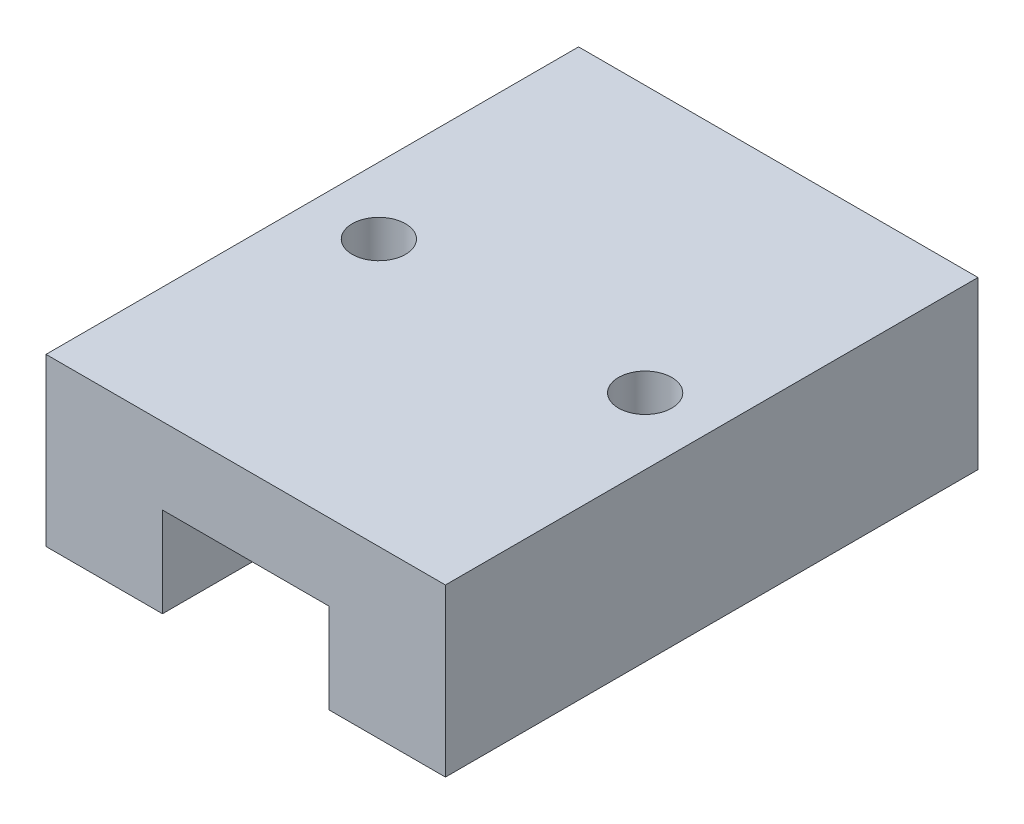
ISO-10303-21;
HEADER;
FILE_DESCRIPTION(('STEP AP214'),'2;1');
FILE_NAME('part.step','',(''),(''),'','','');
FILE_SCHEMA(('AUTOMOTIVE_DESIGN { 1 0 10303 214 1 1 1 1 }'));
ENDSEC;
DATA;
#1=APPLICATION_CONTEXT('core data for automotive mechanical design processes');
#2=APPLICATION_PROTOCOL_DEFINITION('international standard','automotive_design',2000,#1);
#3=PRODUCT_CONTEXT('',#1,'mechanical');
#4=PRODUCT('Part','Part','',(#3));
#5=PRODUCT_RELATED_PRODUCT_CATEGORY('part','',(#4));
#6=PRODUCT_DEFINITION_FORMATION('','',#4);
#7=PRODUCT_DEFINITION_CONTEXT('part definition',#1,'design');
#8=PRODUCT_DEFINITION('design','',#6,#7);
#9=PRODUCT_DEFINITION_SHAPE('','',#8);
#10=(LENGTH_UNIT() NAMED_UNIT(*) SI_UNIT(.MILLI.,.METRE.));
#11=(NAMED_UNIT(*) PLANE_ANGLE_UNIT() SI_UNIT($,.RADIAN.));
#12=(NAMED_UNIT(*) SI_UNIT($,.STERADIAN.) SOLID_ANGLE_UNIT());
#13=UNCERTAINTY_MEASURE_WITH_UNIT(LENGTH_MEASURE(1.E-05),#10,'distance_accuracy_value','');
#14=(GEOMETRIC_REPRESENTATION_CONTEXT(3) GLOBAL_UNCERTAINTY_ASSIGNED_CONTEXT((#13)) GLOBAL_UNIT_ASSIGNED_CONTEXT((#10,
#11,#12)) REPRESENTATION_CONTEXT('',''));
#15=CARTESIAN_POINT('',(0.,0.,0.));
#16=DIRECTION('',(0.,0.,1.));
#17=DIRECTION('',(1.,0.,0.));
#18=AXIS2_PLACEMENT_3D('',#15,#16,#17);
#19=CARTESIAN_POINT('',(2.5,2.7,8.));
#20=DIRECTION('',(0.,1.,0.));
#21=DIRECTION('',(0.,0.,1.));
#22=AXIS2_PLACEMENT_3D('',#19,#20,#21);
#23=PLANE('',#22);
#24=DIRECTION('',(1.,0.,0.));
#25=VECTOR('',#24,1.);
#26=CARTESIAN_POINT('',(2.5,2.7,-8.));
#27=LINE('',#26,#25);
#28=CARTESIAN_POINT('',(-2.5,2.7,-8.));
#29=VERTEX_POINT('',#28);
#30=CARTESIAN_POINT('',(2.5,2.7,-8.));
#31=VERTEX_POINT('',#30);
#32=EDGE_CURVE('E139',#29,#31,#27,.T.);
#33=ORIENTED_EDGE('',*,*,#32,.T.);
#34=DIRECTION('',(0.,0.,-1.));
#35=VECTOR('',#34,1.);
#36=CARTESIAN_POINT('',(2.5,2.7,8.));
#37=LINE('',#36,#35);
#38=CARTESIAN_POINT('',(2.5,2.7,8.));
#39=VERTEX_POINT('',#38);
#40=EDGE_CURVE('E11',#39,#31,#37,.T.);
#41=ORIENTED_EDGE('',*,*,#40,.F.);
#42=DIRECTION('',(1.,0.,0.));
#43=VECTOR('',#42,1.);
#44=CARTESIAN_POINT('',(2.5,2.7,8.));
#45=LINE('',#44,#43);
#46=CARTESIAN_POINT('',(-2.5,2.7,8.));
#47=VERTEX_POINT('',#46);
#48=EDGE_CURVE('E154',#47,#39,#45,.T.);
#49=ORIENTED_EDGE('',*,*,#48,.F.);
#50=DIRECTION('',(0.,0.,-1.));
#51=VECTOR('',#50,1.);
#52=CARTESIAN_POINT('',(-2.5,2.7,8.));
#53=LINE('',#52,#51);
#54=EDGE_CURVE('E135',#47,#29,#53,.T.);
#55=ORIENTED_EDGE('',*,*,#54,.T.);
#56=EDGE_LOOP('',(#33,#41,#49,#55));
#57=FACE_BOUND('',#56,.T.);
#58=ADVANCED_FACE('F40',(#57),#23,.F.);
#59=CARTESIAN_POINT('',(2.5,0.,8.));
#60=DIRECTION('',(1.,0.,0.));
#61=DIRECTION('',(0.,0.,-1.));
#62=AXIS2_PLACEMENT_3D('',#59,#60,#61);
#63=PLANE('',#62);
#64=DIRECTION('',(0.,-1.,0.));
#65=VECTOR('',#64,1.);
#66=CARTESIAN_POINT('',(2.5,0.,-8.));
#67=LINE('',#66,#65);
#68=CARTESIAN_POINT('',(2.5,0.,-8.));
#69=VERTEX_POINT('',#68);
#70=EDGE_CURVE('E142',#31,#69,#67,.T.);
#71=ORIENTED_EDGE('',*,*,#70,.T.);
#72=DIRECTION('',(0.,0.,-1.));
#73=VECTOR('',#72,1.);
#74=CARTESIAN_POINT('',(2.5,0.,8.));
#75=LINE('',#74,#73);
#76=CARTESIAN_POINT('',(2.5,0.,8.));
#77=VERTEX_POINT('',#76);
#78=EDGE_CURVE('E48',#77,#69,#75,.T.);
#79=ORIENTED_EDGE('',*,*,#78,.F.);
#80=DIRECTION('',(0.,-1.,0.));
#81=VECTOR('',#80,1.);
#82=CARTESIAN_POINT('',(2.5,0.,8.));
#83=LINE('',#82,#81);
#84=EDGE_CURVE('E100',#39,#77,#83,.T.);
#85=ORIENTED_EDGE('',*,*,#84,.F.);
#86=ORIENTED_EDGE('',*,*,#40,.T.);
#87=EDGE_LOOP('',(#71,#79,#85,#86));
#88=FACE_BOUND('',#87,.T.);
#89=ADVANCED_FACE('F222',(#88),#63,.F.);
#90=CARTESIAN_POINT('',(6.,0.,8.));
#91=DIRECTION('',(0.,1.,0.));
#92=DIRECTION('',(-1.,0.,0.));
#93=AXIS2_PLACEMENT_3D('',#90,#91,#92);
#94=PLANE('',#93);
#95=DIRECTION('',(1.,0.,0.));
#96=VECTOR('',#95,1.);
#97=CARTESIAN_POINT('',(6.,0.,-8.));
#98=LINE('',#97,#96);
#99=CARTESIAN_POINT('',(6.,0.,-8.));
#100=VERTEX_POINT('',#99);
#101=EDGE_CURVE('E145',#69,#100,#98,.T.);
#102=ORIENTED_EDGE('',*,*,#101,.T.);
#103=DIRECTION('',(0.,0.,-1.));
#104=VECTOR('',#103,1.);
#105=CARTESIAN_POINT('',(6.,0.,8.));
#106=LINE('',#105,#104);
#107=CARTESIAN_POINT('',(6.,0.,8.));
#108=VERTEX_POINT('',#107);
#109=EDGE_CURVE('E161',#108,#100,#106,.T.);
#110=ORIENTED_EDGE('',*,*,#109,.F.);
#111=DIRECTION('',(1.,0.,0.));
#112=VECTOR('',#111,1.);
#113=CARTESIAN_POINT('',(6.,0.,8.));
#114=LINE('',#113,#112);
#115=EDGE_CURVE('E169',#77,#108,#114,.T.);
#116=ORIENTED_EDGE('',*,*,#115,.F.);
#117=ORIENTED_EDGE('',*,*,#78,.T.);
#118=EDGE_LOOP('',(#102,#110,#116,#117));
#119=FACE_BOUND('',#118,.T.);
#120=ADVANCED_FACE('F167',(#119),#94,.F.);
#121=CARTESIAN_POINT('',(6.,5.,8.));
#122=DIRECTION('',(-1.,0.,0.));
#123=DIRECTION('',(0.,-1.,0.));
#124=AXIS2_PLACEMENT_3D('',#121,#122,#123);
#125=PLANE('',#124);
#126=DIRECTION('',(0.,1.,0.));
#127=VECTOR('',#126,1.);
#128=CARTESIAN_POINT('',(6.,5.,-8.));
#129=LINE('',#128,#127);
#130=CARTESIAN_POINT('',(6.,5.,-8.));
#131=VERTEX_POINT('',#130);
#132=EDGE_CURVE('E147',#100,#131,#129,.T.);
#133=ORIENTED_EDGE('',*,*,#132,.T.);
#134=DIRECTION('',(0.,0.,-1.));
#135=VECTOR('',#134,1.);
#136=CARTESIAN_POINT('',(6.,5.,8.));
#137=LINE('',#136,#135);
#138=CARTESIAN_POINT('',(6.,5.,8.));
#139=VERTEX_POINT('',#138);
#140=EDGE_CURVE('E158',#139,#131,#137,.T.);
#141=ORIENTED_EDGE('',*,*,#140,.F.);
#142=DIRECTION('',(0.,1.,0.));
#143=VECTOR('',#142,1.);
#144=CARTESIAN_POINT('',(6.,5.,8.));
#145=LINE('',#144,#143);
#146=EDGE_CURVE('E181',#108,#139,#145,.T.);
#147=ORIENTED_EDGE('',*,*,#146,.F.);
#148=ORIENTED_EDGE('',*,*,#109,.T.);
#149=EDGE_LOOP('',(#133,#141,#147,#148));
#150=FACE_BOUND('',#149,.T.);
#151=ADVANCED_FACE('F177',(#150),#125,.F.);
#152=CARTESIAN_POINT('',(-6.,5.,8.));
#153=DIRECTION('',(0.,-1.,0.));
#154=DIRECTION('',(0.,0.,-1.));
#155=AXIS2_PLACEMENT_3D('',#152,#153,#154);
#156=PLANE('',#155);
#157=CARTESIAN_POINT('',(-4.,5.,0.));
#158=DIRECTION('',(0.,1.,0.));
#159=DIRECTION('',(0.,0.,1.));
#160=AXIS2_PLACEMENT_3D('',#157,#158,#159);
#161=CIRCLE('',#160,0.799999999999999);
#162=CARTESIAN_POINT('',(-4.,5.,0.799999999999999));
#163=VERTEX_POINT('',#162);
#164=EDGE_CURVE('E195',#163,#163,#161,.T.);
#165=ORIENTED_EDGE('',*,*,#164,.F.);
#166=EDGE_LOOP('',(#165));
#167=FACE_BOUND('',#166,.T.);
#168=CARTESIAN_POINT('',(4.,5.,0.));
#169=DIRECTION('',(0.,1.,0.));
#170=DIRECTION('',(0.,0.,1.));
#171=AXIS2_PLACEMENT_3D('',#168,#169,#170);
#172=CIRCLE('',#171,0.799999999999999);
#173=CARTESIAN_POINT('',(4.,5.,0.799999999999997));
#174=VERTEX_POINT('',#173);
#175=EDGE_CURVE('E189',#174,#174,#172,.T.);
#176=ORIENTED_EDGE('',*,*,#175,.F.);
#177=EDGE_LOOP('',(#176));
#178=FACE_BOUND('',#177,.T.);
#179=DIRECTION('',(-1.,0.,0.));
#180=VECTOR('',#179,1.);
#181=CARTESIAN_POINT('',(-6.,5.,-8.));
#182=LINE('',#181,#180);
#183=CARTESIAN_POINT('',(-6.,5.,-8.));
#184=VERTEX_POINT('',#183);
#185=EDGE_CURVE('E149',#131,#184,#182,.T.);
#186=ORIENTED_EDGE('',*,*,#185,.T.);
#187=DIRECTION('',(0.,0.,-1.));
#188=VECTOR('',#187,1.);
#189=CARTESIAN_POINT('',(-6.,5.,8.));
#190=LINE('',#189,#188);
#191=CARTESIAN_POINT('',(-6.,5.,8.));
#192=VERTEX_POINT('',#191);
#193=EDGE_CURVE('E130',#192,#184,#190,.T.);
#194=ORIENTED_EDGE('',*,*,#193,.F.);
#195=DIRECTION('',(-1.,0.,0.));
#196=VECTOR('',#195,1.);
#197=CARTESIAN_POINT('',(-6.,5.,8.));
#198=LINE('',#197,#196);
#199=EDGE_CURVE('E121',#139,#192,#198,.T.);
#200=ORIENTED_EDGE('',*,*,#199,.F.);
#201=ORIENTED_EDGE('',*,*,#140,.T.);
#202=EDGE_LOOP('',(#186,#194,#200,#201));
#203=FACE_BOUND('',#202,.T.);
#204=ADVANCED_FACE('F180',(#167,#178,#203),#156,.F.);
#205=CARTESIAN_POINT('',(-6.,5.,8.));
#206=DIRECTION('',(1.,0.,0.));
#207=DIRECTION('',(0.,1.,0.));
#208=AXIS2_PLACEMENT_3D('',#205,#206,#207);
#209=PLANE('',#208);
#210=DIRECTION('',(0.,-1.,0.));
#211=VECTOR('',#210,1.);
#212=CARTESIAN_POINT('',(-6.,5.,-8.));
#213=LINE('',#212,#211);
#214=CARTESIAN_POINT('',(-6.,0.,-8.));
#215=VERTEX_POINT('',#214);
#216=EDGE_CURVE('E129',#184,#215,#213,.T.);
#217=ORIENTED_EDGE('',*,*,#216,.T.);
#218=DIRECTION('',(0.,0.,-1.));
#219=VECTOR('',#218,1.);
#220=CARTESIAN_POINT('',(-6.,0.,8.));
#221=LINE('',#220,#219);
#222=CARTESIAN_POINT('',(-6.,0.,8.));
#223=VERTEX_POINT('',#222);
#224=EDGE_CURVE('E126',#223,#215,#221,.T.);
#225=ORIENTED_EDGE('',*,*,#224,.F.);
#226=DIRECTION('',(0.,-1.,0.));
#227=VECTOR('',#226,1.);
#228=CARTESIAN_POINT('',(-6.,5.,8.));
#229=LINE('',#228,#227);
#230=EDGE_CURVE('E115',#192,#223,#229,.T.);
#231=ORIENTED_EDGE('',*,*,#230,.F.);
#232=ORIENTED_EDGE('',*,*,#193,.T.);
#233=EDGE_LOOP('',(#217,#225,#231,#232));
#234=FACE_BOUND('',#233,.T.);
#235=ADVANCED_FACE('F127',(#234),#209,.F.);
#236=CARTESIAN_POINT('',(-6.,0.,8.));
#237=DIRECTION('',(0.,1.,0.));
#238=DIRECTION('',(-1.,0.,0.));
#239=AXIS2_PLACEMENT_3D('',#236,#237,#238);
#240=PLANE('',#239);
#241=DIRECTION('',(1.,0.,0.));
#242=VECTOR('',#241,1.);
#243=CARTESIAN_POINT('',(-6.,0.,-8.));
#244=LINE('',#243,#242);
#245=CARTESIAN_POINT('',(-2.5,0.,-8.));
#246=VERTEX_POINT('',#245);
#247=EDGE_CURVE('E86',#215,#246,#244,.T.);
#248=ORIENTED_EDGE('',*,*,#247,.T.);
#249=DIRECTION('',(0.,0.,-1.));
#250=VECTOR('',#249,1.);
#251=CARTESIAN_POINT('',(-2.5,0.,8.));
#252=LINE('',#251,#250);
#253=CARTESIAN_POINT('',(-2.5,0.,8.));
#254=VERTEX_POINT('',#253);
#255=EDGE_CURVE('E131',#254,#246,#252,.T.);
#256=ORIENTED_EDGE('',*,*,#255,.F.);
#257=DIRECTION('',(1.,0.,0.));
#258=VECTOR('',#257,1.);
#259=CARTESIAN_POINT('',(-6.,0.,8.));
#260=LINE('',#259,#258);
#261=EDGE_CURVE('E119',#223,#254,#260,.T.);
#262=ORIENTED_EDGE('',*,*,#261,.F.);
#263=ORIENTED_EDGE('',*,*,#224,.T.);
#264=EDGE_LOOP('',(#248,#256,#262,#263));
#265=FACE_BOUND('',#264,.T.);
#266=ADVANCED_FACE('F133',(#265),#240,.F.);
#267=CARTESIAN_POINT('',(-2.5,0.,8.));
#268=DIRECTION('',(-1.,0.,0.));
#269=DIRECTION('',(0.,0.,1.));
#270=AXIS2_PLACEMENT_3D('',#267,#268,#269);
#271=PLANE('',#270);
#272=DIRECTION('',(0.,1.,0.));
#273=VECTOR('',#272,1.);
#274=CARTESIAN_POINT('',(-2.5,0.,-8.));
#275=LINE('',#274,#273);
#276=EDGE_CURVE('E92',#246,#29,#275,.T.);
#277=ORIENTED_EDGE('',*,*,#276,.T.);
#278=ORIENTED_EDGE('',*,*,#54,.F.);
#279=DIRECTION('',(0.,1.,0.));
#280=VECTOR('',#279,1.);
#281=CARTESIAN_POINT('',(-2.5,0.,8.));
#282=LINE('',#281,#280);
#283=EDGE_CURVE('E56',#254,#47,#282,.T.);
#284=ORIENTED_EDGE('',*,*,#283,.F.);
#285=ORIENTED_EDGE('',*,*,#255,.T.);
#286=EDGE_LOOP('',(#277,#278,#284,#285));
#287=FACE_BOUND('',#286,.T.);
#288=ADVANCED_FACE('F229',(#287),#271,.F.);
#289=CARTESIAN_POINT('',(0.,0.,8.));
#290=DIRECTION('',(0.,0.,-1.));
#291=DIRECTION('',(-1.,0.,0.));
#292=AXIS2_PLACEMENT_3D('',#289,#290,#291);
#293=PLANE('',#292);
#294=ORIENTED_EDGE('',*,*,#48,.T.);
#295=ORIENTED_EDGE('',*,*,#84,.T.);
#296=ORIENTED_EDGE('',*,*,#115,.T.);
#297=ORIENTED_EDGE('',*,*,#146,.T.);
#298=ORIENTED_EDGE('',*,*,#199,.T.);
#299=ORIENTED_EDGE('',*,*,#230,.T.);
#300=ORIENTED_EDGE('',*,*,#261,.T.);
#301=ORIENTED_EDGE('',*,*,#283,.T.);
#302=EDGE_LOOP('',(#294,#295,#296,#297,#298,#299,#300,#301));
#303=FACE_BOUND('',#302,.T.);
#304=ADVANCED_FACE('F117',(#303),#293,.F.);
#305=CARTESIAN_POINT('',(0.,0.,-8.));
#306=DIRECTION('',(0.,0.,-1.));
#307=DIRECTION('',(-1.,0.,0.));
#308=AXIS2_PLACEMENT_3D('',#305,#306,#307);
#309=PLANE('',#308);
#310=ORIENTED_EDGE('',*,*,#32,.F.);
#311=ORIENTED_EDGE('',*,*,#276,.F.);
#312=ORIENTED_EDGE('',*,*,#247,.F.);
#313=ORIENTED_EDGE('',*,*,#216,.F.);
#314=ORIENTED_EDGE('',*,*,#185,.F.);
#315=ORIENTED_EDGE('',*,*,#132,.F.);
#316=ORIENTED_EDGE('',*,*,#101,.F.);
#317=ORIENTED_EDGE('',*,*,#70,.F.);
#318=EDGE_LOOP('',(#310,#311,#312,#313,#314,#315,#316,#317));
#319=FACE_BOUND('',#318,.T.);
#320=ADVANCED_FACE('F173',(#319),#309,.T.);
#321=CARTESIAN_POINT('',(4.,2.3,0.));
#322=DIRECTION('',(0.,1.,0.));
#323=DIRECTION('',(0.,0.,1.));
#324=AXIS2_PLACEMENT_3D('',#321,#322,#323);
#325=CONICAL_SURFACE('',#324,0.799999999999999,1.02974425867665);
#326=CARTESIAN_POINT('',(4.,1.81931150477795,0.));
#327=VERTEX_POINT('',#326);
#328=VERTEX_LOOP('',#327);
#329=FACE_BOUND('',#328,.T.);
#330=CARTESIAN_POINT('',(4.,2.3,0.));
#331=DIRECTION('',(0.,1.,0.));
#332=DIRECTION('',(0.,0.,1.));
#333=AXIS2_PLACEMENT_3D('',#330,#331,#332);
#334=CIRCLE('',#333,0.799999999999999);
#335=CARTESIAN_POINT('',(4.,2.3,0.799999999999997));
#336=VERTEX_POINT('',#335);
#337=EDGE_CURVE('E143',#336,#336,#334,.T.);
#338=ORIENTED_EDGE('',*,*,#337,.T.);
#339=EDGE_LOOP('',(#338));
#340=FACE_BOUND('',#339,.T.);
#341=ADVANCED_FACE('F209',(#329,#340),#325,.F.);
#342=CARTESIAN_POINT('',(4.,5.,0.));
#343=DIRECTION('',(0.,1.,0.));
#344=DIRECTION('',(0.,0.,1.));
#345=AXIS2_PLACEMENT_3D('',#342,#343,#344);
#346=CYLINDRICAL_SURFACE('',#345,0.799999999999999);
#347=ORIENTED_EDGE('',*,*,#337,.F.);
#348=EDGE_LOOP('',(#347));
#349=FACE_BOUND('',#348,.T.);
#350=ORIENTED_EDGE('',*,*,#175,.T.);
#351=EDGE_LOOP('',(#350));
#352=FACE_BOUND('',#351,.T.);
#353=ADVANCED_FACE('F206',(#349,#352),#346,.F.);
#354=CARTESIAN_POINT('',(-4.,2.3,0.));
#355=DIRECTION('',(0.,1.,0.));
#356=DIRECTION('',(0.,0.,1.));
#357=AXIS2_PLACEMENT_3D('',#354,#355,#356);
#358=CONICAL_SURFACE('',#357,0.799999999999999,1.02974425867665);
#359=CARTESIAN_POINT('',(-4.,1.81931150477795,0.));
#360=VERTEX_POINT('',#359);
#361=VERTEX_LOOP('',#360);
#362=FACE_BOUND('',#361,.T.);
#363=CARTESIAN_POINT('',(-4.,2.3,0.));
#364=DIRECTION('',(0.,1.,0.));
#365=DIRECTION('',(0.,0.,1.));
#366=AXIS2_PLACEMENT_3D('',#363,#364,#365);
#367=CIRCLE('',#366,0.799999999999999);
#368=CARTESIAN_POINT('',(-4.,2.3,0.799999999999999));
#369=VERTEX_POINT('',#368);
#370=EDGE_CURVE('E192',#369,#369,#367,.T.);
#371=ORIENTED_EDGE('',*,*,#370,.T.);
#372=EDGE_LOOP('',(#371));
#373=FACE_BOUND('',#372,.T.);
#374=ADVANCED_FACE('F208',(#362,#373),#358,.F.);
#375=CARTESIAN_POINT('',(-4.,5.,0.));
#376=DIRECTION('',(0.,1.,0.));
#377=DIRECTION('',(0.,0.,1.));
#378=AXIS2_PLACEMENT_3D('',#375,#376,#377);
#379=CYLINDRICAL_SURFACE('',#378,0.799999999999999);
#380=ORIENTED_EDGE('',*,*,#370,.F.);
#381=EDGE_LOOP('',(#380));
#382=FACE_BOUND('',#381,.T.);
#383=ORIENTED_EDGE('',*,*,#164,.T.);
#384=EDGE_LOOP('',(#383));
#385=FACE_BOUND('',#384,.T.);
#386=ADVANCED_FACE('F199',(#382,#385),#379,.F.);
#387=CLOSED_SHELL('',(#58,#89,#120,#151,#204,#235,#266,#288,#304,#320,#341,#353,#374,#386));
#388=MANIFOLD_SOLID_BREP('B2',#387);
#389=ADVANCED_BREP_SHAPE_REPRESENTATION('',(#18,#388),#14);
#390=SHAPE_DEFINITION_REPRESENTATION(#9,#389);
ENDSEC;
END-ISO-10303-21;
